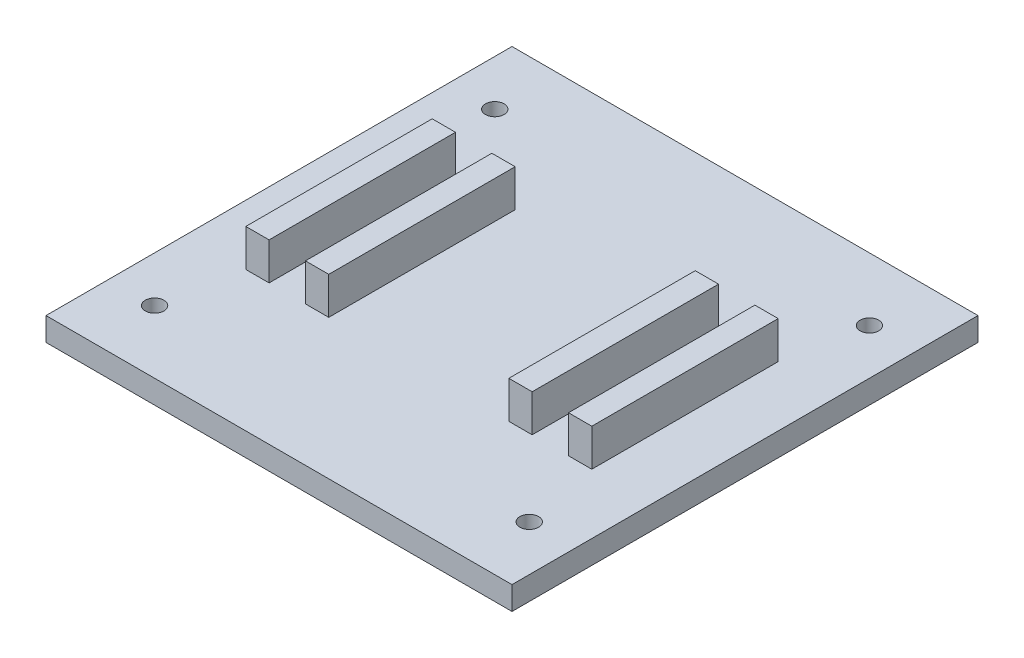
ISO-10303-21;
HEADER;
FILE_DESCRIPTION(('STEP AP214'),'2;1');
FILE_NAME('part.step','',(''),(''),'','','');
FILE_SCHEMA(('AUTOMOTIVE_DESIGN { 1 0 10303 214 1 1 1 1 }'));
ENDSEC;
DATA;
#1=APPLICATION_CONTEXT('core data for automotive mechanical design processes');
#2=APPLICATION_PROTOCOL_DEFINITION('international standard','automotive_design',2000,#1);
#3=PRODUCT_CONTEXT('',#1,'mechanical');
#4=PRODUCT('Part','Part','',(#3));
#5=PRODUCT_RELATED_PRODUCT_CATEGORY('part','',(#4));
#6=PRODUCT_DEFINITION_FORMATION('','',#4);
#7=PRODUCT_DEFINITION_CONTEXT('part definition',#1,'design');
#8=PRODUCT_DEFINITION('design','',#6,#7);
#9=PRODUCT_DEFINITION_SHAPE('','',#8);
#10=(LENGTH_UNIT() NAMED_UNIT(*) SI_UNIT(.MILLI.,.METRE.));
#11=(NAMED_UNIT(*) PLANE_ANGLE_UNIT() SI_UNIT($,.RADIAN.));
#12=(NAMED_UNIT(*) SI_UNIT($,.STERADIAN.) SOLID_ANGLE_UNIT());
#13=UNCERTAINTY_MEASURE_WITH_UNIT(LENGTH_MEASURE(1.E-05),#10,'distance_accuracy_value','');
#14=(GEOMETRIC_REPRESENTATION_CONTEXT(3) GLOBAL_UNCERTAINTY_ASSIGNED_CONTEXT((#13)) GLOBAL_UNIT_ASSIGNED_CONTEXT((#10,
#11,#12)) REPRESENTATION_CONTEXT('',''));
#15=CARTESIAN_POINT('',(0.,0.,0.));
#16=DIRECTION('',(0.,0.,1.));
#17=DIRECTION('',(1.,0.,0.));
#18=AXIS2_PLACEMENT_3D('',#15,#16,#17);
#19=CARTESIAN_POINT('',(0.,5.,0.));
#20=DIRECTION('',(0.,1.,0.));
#21=DIRECTION('',(0.,0.,1.));
#22=AXIS2_PLACEMENT_3D('',#19,#20,#21);
#23=PLANE('',#22);
#24=CARTESIAN_POINT('',(-40.2,5.,-36.5));
#25=DIRECTION('',(0.,1.,0.));
#26=DIRECTION('',(0.,0.,-1.));
#27=AXIS2_PLACEMENT_3D('',#24,#25,#26);
#28=CIRCLE('',#27,2.);
#29=CARTESIAN_POINT('',(-40.2,5.,-38.5));
#30=VERTEX_POINT('',#29);
#31=EDGE_CURVE('E714',#30,#30,#28,.T.);
#32=ORIENTED_EDGE('',*,*,#31,.F.);
#33=EDGE_LOOP('',(#32));
#34=FACE_BOUND('',#33,.T.);
#35=CARTESIAN_POINT('',(-40.2,5.,36.5));
#36=DIRECTION('',(0.,1.,0.));
#37=DIRECTION('',(0.,0.,1.));
#38=AXIS2_PLACEMENT_3D('',#35,#36,#37);
#39=CIRCLE('',#38,2.);
#40=CARTESIAN_POINT('',(-40.2,5.,38.5));
#41=VERTEX_POINT('',#40);
#42=EDGE_CURVE('E716',#41,#41,#39,.T.);
#43=ORIENTED_EDGE('',*,*,#42,.F.);
#44=EDGE_LOOP('',(#43));
#45=FACE_BOUND('',#44,.T.);
#46=CARTESIAN_POINT('',(40.2,5.,36.5));
#47=DIRECTION('',(0.,1.,0.));
#48=DIRECTION('',(0.,0.,-1.));
#49=AXIS2_PLACEMENT_3D('',#46,#47,#48);
#50=CIRCLE('',#49,2.);
#51=CARTESIAN_POINT('',(40.2,5.,34.5));
#52=VERTEX_POINT('',#51);
#53=EDGE_CURVE('E720',#52,#52,#50,.T.);
#54=ORIENTED_EDGE('',*,*,#53,.F.);
#55=EDGE_LOOP('',(#54));
#56=FACE_BOUND('',#55,.T.);
#57=CARTESIAN_POINT('',(40.2,5.,-36.5));
#58=DIRECTION('',(0.,1.,0.));
#59=DIRECTION('',(0.,0.,1.));
#60=AXIS2_PLACEMENT_3D('',#57,#58,#59);
#61=CIRCLE('',#60,2.);
#62=CARTESIAN_POINT('',(40.2,5.,-34.5));
#63=VERTEX_POINT('',#62);
#64=EDGE_CURVE('E393',#63,#63,#61,.T.);
#65=ORIENTED_EDGE('',*,*,#64,.F.);
#66=EDGE_LOOP('',(#65));
#67=FACE_BOUND('',#66,.T.);
#68=DIRECTION('',(1.,0.,0.));
#69=VECTOR('',#68,1.);
#70=CARTESIAN_POINT('',(32.125,5.,-20.));
#71=LINE('',#70,#69);
#72=CARTESIAN_POINT('',(32.125,5.,-20.));
#73=VERTEX_POINT('',#72);
#74=CARTESIAN_POINT('',(37.125,5.,-20.));
#75=VERTEX_POINT('',#74);
#76=EDGE_CURVE('E176',#73,#75,#71,.T.);
#77=ORIENTED_EDGE('',*,*,#76,.T.);
#78=DIRECTION('',(0.,0.,1.));
#79=VECTOR('',#78,1.);
#80=CARTESIAN_POINT('',(37.125,5.,-20.));
#81=LINE('',#80,#79);
#82=CARTESIAN_POINT('',(37.125,5.,20.));
#83=VERTEX_POINT('',#82);
#84=EDGE_CURVE('E180',#75,#83,#81,.T.);
#85=ORIENTED_EDGE('',*,*,#84,.T.);
#86=DIRECTION('',(-1.,0.,0.));
#87=VECTOR('',#86,1.);
#88=CARTESIAN_POINT('',(37.125,5.,20.));
#89=LINE('',#88,#87);
#90=CARTESIAN_POINT('',(32.125,5.,20.));
#91=VERTEX_POINT('',#90);
#92=EDGE_CURVE('E62',#83,#91,#89,.T.);
#93=ORIENTED_EDGE('',*,*,#92,.T.);
#94=DIRECTION('',(0.,0.,1.));
#95=VECTOR('',#94,1.);
#96=CARTESIAN_POINT('',(32.125,5.,-20.));
#97=LINE('',#96,#95);
#98=EDGE_CURVE('E57',#73,#91,#97,.T.);
#99=ORIENTED_EDGE('',*,*,#98,.F.);
#100=EDGE_LOOP('',(#77,#85,#93,#99));
#101=FACE_BOUND('',#100,.T.);
#102=DIRECTION('',(1.,0.,0.));
#103=VECTOR('',#102,1.);
#104=CARTESIAN_POINT('',(-24.325,5.,-20.));
#105=LINE('',#104,#103);
#106=CARTESIAN_POINT('',(-24.325,5.,-20.));
#107=VERTEX_POINT('',#106);
#108=CARTESIAN_POINT('',(-19.325,5.,-20.));
#109=VERTEX_POINT('',#108);
#110=EDGE_CURVE('E293',#107,#109,#105,.T.);
#111=ORIENTED_EDGE('',*,*,#110,.T.);
#112=DIRECTION('',(0.,0.,1.));
#113=VECTOR('',#112,1.);
#114=CARTESIAN_POINT('',(-19.325,5.,-20.));
#115=LINE('',#114,#113);
#116=CARTESIAN_POINT('',(-19.325,5.,20.));
#117=VERTEX_POINT('',#116);
#118=EDGE_CURVE('E324',#109,#117,#115,.T.);
#119=ORIENTED_EDGE('',*,*,#118,.T.);
#120=DIRECTION('',(1.,0.,0.));
#121=VECTOR('',#120,1.);
#122=CARTESIAN_POINT('',(-24.325,5.,20.));
#123=LINE('',#122,#121);
#124=CARTESIAN_POINT('',(-24.325,5.,20.));
#125=VERTEX_POINT('',#124);
#126=EDGE_CURVE('E327',#125,#117,#123,.T.);
#127=ORIENTED_EDGE('',*,*,#126,.F.);
#128=DIRECTION('',(0.,0.,1.));
#129=VECTOR('',#128,1.);
#130=CARTESIAN_POINT('',(-24.325,5.,-20.));
#131=LINE('',#130,#129);
#132=EDGE_CURVE('E311',#107,#125,#131,.T.);
#133=ORIENTED_EDGE('',*,*,#132,.F.);
#134=EDGE_LOOP('',(#111,#119,#127,#133));
#135=FACE_BOUND('',#134,.T.);
#136=DIRECTION('',(1.,0.,0.));
#137=VECTOR('',#136,1.);
#138=CARTESIAN_POINT('',(-50.,5.,50.));
#139=LINE('',#138,#137);
#140=CARTESIAN_POINT('',(-50.,5.,50.));
#141=VERTEX_POINT('',#140);
#142=CARTESIAN_POINT('',(50.,5.,50.));
#143=VERTEX_POINT('',#142);
#144=EDGE_CURVE('E350',#141,#143,#139,.T.);
#145=ORIENTED_EDGE('',*,*,#144,.T.);
#146=DIRECTION('',(0.,0.,-1.));
#147=VECTOR('',#146,1.);
#148=CARTESIAN_POINT('',(50.,5.,50.));
#149=LINE('',#148,#147);
#150=CARTESIAN_POINT('',(50.,5.,-50.));
#151=VERTEX_POINT('',#150);
#152=EDGE_CURVE('E354',#143,#151,#149,.T.);
#153=ORIENTED_EDGE('',*,*,#152,.T.);
#154=DIRECTION('',(1.,0.,0.));
#155=VECTOR('',#154,1.);
#156=CARTESIAN_POINT('',(-50.,5.,-50.));
#157=LINE('',#156,#155);
#158=CARTESIAN_POINT('',(-50.,5.,-50.));
#159=VERTEX_POINT('',#158);
#160=EDGE_CURVE('E358',#159,#151,#157,.T.);
#161=ORIENTED_EDGE('',*,*,#160,.F.);
#162=DIRECTION('',(0.,0.,-1.));
#163=VECTOR('',#162,1.);
#164=CARTESIAN_POINT('',(-50.,5.,50.));
#165=LINE('',#164,#163);
#166=EDGE_CURVE('E362',#141,#159,#165,.T.);
#167=ORIENTED_EDGE('',*,*,#166,.F.);
#168=EDGE_LOOP('',(#145,#153,#161,#167));
#169=FACE_BOUND('',#168,.T.);
#170=DIRECTION('',(0.,0.,1.));
#171=VECTOR('',#170,1.);
#172=CARTESIAN_POINT('',(-37.125,5.,-20.));
#173=LINE('',#172,#171);
#174=CARTESIAN_POINT('',(-37.125,5.,-20.));
#175=VERTEX_POINT('',#174);
#176=CARTESIAN_POINT('',(-37.125,5.,20.));
#177=VERTEX_POINT('',#176);
#178=EDGE_CURVE('E285',#175,#177,#173,.T.);
#179=ORIENTED_EDGE('',*,*,#178,.F.);
#180=DIRECTION('',(-1.,0.,0.));
#181=VECTOR('',#180,1.);
#182=CARTESIAN_POINT('',(-32.125,5.,-20.));
#183=LINE('',#182,#181);
#184=CARTESIAN_POINT('',(-32.125,5.,-20.));
#185=VERTEX_POINT('',#184);
#186=EDGE_CURVE('E289',#185,#175,#183,.T.);
#187=ORIENTED_EDGE('',*,*,#186,.F.);
#188=DIRECTION('',(0.,0.,1.));
#189=VECTOR('',#188,1.);
#190=CARTESIAN_POINT('',(-32.125,5.,-20.));
#191=LINE('',#190,#189);
#192=CARTESIAN_POINT('',(-32.125,5.,20.));
#193=VERTEX_POINT('',#192);
#194=EDGE_CURVE('E277',#185,#193,#191,.T.);
#195=ORIENTED_EDGE('',*,*,#194,.T.);
#196=DIRECTION('',(1.,0.,0.));
#197=VECTOR('',#196,1.);
#198=CARTESIAN_POINT('',(-37.125,5.,20.));
#199=LINE('',#198,#197);
#200=EDGE_CURVE('E280',#177,#193,#199,.T.);
#201=ORIENTED_EDGE('',*,*,#200,.F.);
#202=EDGE_LOOP('',(#179,#187,#195,#201));
#203=FACE_BOUND('',#202,.T.);
#204=DIRECTION('',(0.,0.,1.));
#205=VECTOR('',#204,1.);
#206=CARTESIAN_POINT('',(19.325,5.,-20.));
#207=LINE('',#206,#205);
#208=CARTESIAN_POINT('',(19.325,5.,-20.));
#209=VERTEX_POINT('',#208);
#210=CARTESIAN_POINT('',(19.325,5.,20.));
#211=VERTEX_POINT('',#210);
#212=EDGE_CURVE('E239',#209,#211,#207,.T.);
#213=ORIENTED_EDGE('',*,*,#212,.F.);
#214=DIRECTION('',(-1.,0.,0.));
#215=VECTOR('',#214,1.);
#216=CARTESIAN_POINT('',(24.325,5.,-20.));
#217=LINE('',#216,#215);
#218=CARTESIAN_POINT('',(24.325,5.,-20.));
#219=VERTEX_POINT('',#218);
#220=EDGE_CURVE('E243',#219,#209,#217,.T.);
#221=ORIENTED_EDGE('',*,*,#220,.F.);
#222=DIRECTION('',(0.,0.,1.));
#223=VECTOR('',#222,1.);
#224=CARTESIAN_POINT('',(24.325,5.,-20.));
#225=LINE('',#224,#223);
#226=CARTESIAN_POINT('',(24.325,5.,20.));
#227=VERTEX_POINT('',#226);
#228=EDGE_CURVE('E232',#219,#227,#225,.T.);
#229=ORIENTED_EDGE('',*,*,#228,.T.);
#230=DIRECTION('',(-1.,0.,0.));
#231=VECTOR('',#230,1.);
#232=CARTESIAN_POINT('',(24.325,5.,20.));
#233=LINE('',#232,#231);
#234=EDGE_CURVE('E235',#227,#211,#233,.T.);
#235=ORIENTED_EDGE('',*,*,#234,.T.);
#236=EDGE_LOOP('',(#213,#221,#229,#235));
#237=FACE_BOUND('',#236,.T.);
#238=ADVANCED_FACE('F39',(#34,#45,#56,#67,#101,#135,#169,#203,#237),#23,.T.);
#239=CARTESIAN_POINT('',(-50.,5.,50.));
#240=DIRECTION('',(0.,0.,-1.));
#241=DIRECTION('',(-1.,0.,0.));
#242=AXIS2_PLACEMENT_3D('',#239,#240,#241);
#243=PLANE('',#242);
#244=DIRECTION('',(1.,0.,0.));
#245=VECTOR('',#244,1.);
#246=CARTESIAN_POINT('',(-50.,0.,50.));
#247=LINE('',#246,#245);
#248=CARTESIAN_POINT('',(-50.,0.,50.));
#249=VERTEX_POINT('',#248);
#250=CARTESIAN_POINT('',(50.,0.,50.));
#251=VERTEX_POINT('',#250);
#252=EDGE_CURVE('E338',#249,#251,#247,.T.);
#253=ORIENTED_EDGE('',*,*,#252,.T.);
#254=DIRECTION('',(0.,-1.,0.));
#255=VECTOR('',#254,1.);
#256=CARTESIAN_POINT('',(50.,5.,50.));
#257=LINE('',#256,#255);
#258=EDGE_CURVE('E11',#143,#251,#257,.T.);
#259=ORIENTED_EDGE('',*,*,#258,.F.);
#260=ORIENTED_EDGE('',*,*,#144,.F.);
#261=DIRECTION('',(0.,-1.,0.));
#262=VECTOR('',#261,1.);
#263=CARTESIAN_POINT('',(-50.,5.,50.));
#264=LINE('',#263,#262);
#265=EDGE_CURVE('E366',#141,#249,#264,.T.);
#266=ORIENTED_EDGE('',*,*,#265,.T.);
#267=EDGE_LOOP('',(#253,#259,#260,#266));
#268=FACE_BOUND('',#267,.T.);
#269=ADVANCED_FACE('F41',(#268),#243,.F.);
#270=CARTESIAN_POINT('',(50.,5.,50.));
#271=DIRECTION('',(-1.,0.,0.));
#272=DIRECTION('',(0.,0.,1.));
#273=AXIS2_PLACEMENT_3D('',#270,#271,#272);
#274=PLANE('',#273);
#275=DIRECTION('',(0.,0.,-1.));
#276=VECTOR('',#275,1.);
#277=CARTESIAN_POINT('',(50.,0.,50.));
#278=LINE('',#277,#276);
#279=CARTESIAN_POINT('',(50.,0.,-50.));
#280=VERTEX_POINT('',#279);
#281=EDGE_CURVE('E370',#251,#280,#278,.T.);
#282=ORIENTED_EDGE('',*,*,#281,.T.);
#283=DIRECTION('',(0.,-1.,0.));
#284=VECTOR('',#283,1.);
#285=CARTESIAN_POINT('',(50.,5.,-50.));
#286=LINE('',#285,#284);
#287=EDGE_CURVE('E49',#151,#280,#286,.T.);
#288=ORIENTED_EDGE('',*,*,#287,.F.);
#289=ORIENTED_EDGE('',*,*,#152,.F.);
#290=ORIENTED_EDGE('',*,*,#258,.T.);
#291=EDGE_LOOP('',(#282,#288,#289,#290));
#292=FACE_BOUND('',#291,.T.);
#293=ADVANCED_FACE('F441',(#292),#274,.F.);
#294=CARTESIAN_POINT('',(-50.,5.,-50.));
#295=DIRECTION('',(0.,0.,-1.));
#296=DIRECTION('',(-1.,0.,0.));
#297=AXIS2_PLACEMENT_3D('',#294,#295,#296);
#298=PLANE('',#297);
#299=DIRECTION('',(1.,0.,0.));
#300=VECTOR('',#299,1.);
#301=CARTESIAN_POINT('',(-50.,0.,-50.));
#302=LINE('',#301,#300);
#303=CARTESIAN_POINT('',(-50.,0.,-50.));
#304=VERTEX_POINT('',#303);
#305=EDGE_CURVE('E374',#304,#280,#302,.T.);
#306=ORIENTED_EDGE('',*,*,#305,.F.);
#307=DIRECTION('',(0.,-1.,0.));
#308=VECTOR('',#307,1.);
#309=CARTESIAN_POINT('',(-50.,5.,-50.));
#310=LINE('',#309,#308);
#311=EDGE_CURVE('E383',#159,#304,#310,.T.);
#312=ORIENTED_EDGE('',*,*,#311,.F.);
#313=ORIENTED_EDGE('',*,*,#160,.T.);
#314=ORIENTED_EDGE('',*,*,#287,.T.);
#315=EDGE_LOOP('',(#306,#312,#313,#314));
#316=FACE_BOUND('',#315,.T.);
#317=ADVANCED_FACE('F455',(#316),#298,.T.);
#318=CARTESIAN_POINT('',(-50.,5.,50.));
#319=DIRECTION('',(-1.,0.,0.));
#320=DIRECTION('',(0.,0.,1.));
#321=AXIS2_PLACEMENT_3D('',#318,#319,#320);
#322=PLANE('',#321);
#323=DIRECTION('',(0.,0.,-1.));
#324=VECTOR('',#323,1.);
#325=CARTESIAN_POINT('',(-50.,0.,50.));
#326=LINE('',#325,#324);
#327=EDGE_CURVE('E355',#249,#304,#326,.T.);
#328=ORIENTED_EDGE('',*,*,#327,.F.);
#329=ORIENTED_EDGE('',*,*,#265,.F.);
#330=ORIENTED_EDGE('',*,*,#166,.T.);
#331=ORIENTED_EDGE('',*,*,#311,.T.);
#332=EDGE_LOOP('',(#328,#329,#330,#331));
#333=FACE_BOUND('',#332,.T.);
#334=ADVANCED_FACE('F452',(#333),#322,.T.);
#335=CARTESIAN_POINT('',(0.,0.,0.));
#336=DIRECTION('',(0.,1.,0.));
#337=DIRECTION('',(0.,0.,1.));
#338=AXIS2_PLACEMENT_3D('',#335,#336,#337);
#339=PLANE('',#338);
#340=CARTESIAN_POINT('',(-40.2,0.,-36.5));
#341=DIRECTION('',(0.,1.,0.));
#342=DIRECTION('',(0.,0.,1.));
#343=AXIS2_PLACEMENT_3D('',#340,#341,#342);
#344=CIRCLE('',#343,2.);
#345=CARTESIAN_POINT('',(-40.2,0.,-34.5));
#346=VERTEX_POINT('',#345);
#347=EDGE_CURVE('E43',#346,#346,#344,.T.);
#348=ORIENTED_EDGE('',*,*,#347,.T.);
#349=EDGE_LOOP('',(#348));
#350=FACE_BOUND('',#349,.T.);
#351=CARTESIAN_POINT('',(-40.2,0.,36.5));
#352=DIRECTION('',(0.,1.,0.));
#353=DIRECTION('',(0.,0.,1.));
#354=AXIS2_PLACEMENT_3D('',#351,#352,#353);
#355=CIRCLE('',#354,2.);
#356=CARTESIAN_POINT('',(-40.2,0.,38.5));
#357=VERTEX_POINT('',#356);
#358=EDGE_CURVE('E396',#357,#357,#355,.T.);
#359=ORIENTED_EDGE('',*,*,#358,.T.);
#360=EDGE_LOOP('',(#359));
#361=FACE_BOUND('',#360,.T.);
#362=CARTESIAN_POINT('',(40.2,0.,36.5));
#363=DIRECTION('',(0.,1.,0.));
#364=DIRECTION('',(0.,0.,1.));
#365=AXIS2_PLACEMENT_3D('',#362,#363,#364);
#366=CIRCLE('',#365,2.);
#367=CARTESIAN_POINT('',(40.2,0.,38.5));
#368=VERTEX_POINT('',#367);
#369=EDGE_CURVE('E392',#368,#368,#366,.T.);
#370=ORIENTED_EDGE('',*,*,#369,.T.);
#371=EDGE_LOOP('',(#370));
#372=FACE_BOUND('',#371,.T.);
#373=CARTESIAN_POINT('',(40.2,0.,-36.5));
#374=DIRECTION('',(0.,1.,0.));
#375=DIRECTION('',(0.,0.,1.));
#376=AXIS2_PLACEMENT_3D('',#373,#374,#375);
#377=CIRCLE('',#376,2.);
#378=CARTESIAN_POINT('',(40.2,0.,-34.5));
#379=VERTEX_POINT('',#378);
#380=EDGE_CURVE('E388',#379,#379,#377,.T.);
#381=ORIENTED_EDGE('',*,*,#380,.T.);
#382=EDGE_LOOP('',(#381));
#383=FACE_BOUND('',#382,.T.);
#384=ORIENTED_EDGE('',*,*,#252,.F.);
#385=ORIENTED_EDGE('',*,*,#327,.T.);
#386=ORIENTED_EDGE('',*,*,#305,.T.);
#387=ORIENTED_EDGE('',*,*,#281,.F.);
#388=EDGE_LOOP('',(#384,#385,#386,#387));
#389=FACE_BOUND('',#388,.T.);
#390=ADVANCED_FACE('F449',(#350,#361,#372,#383,#389),#339,.F.);
#391=CARTESIAN_POINT('',(-24.325,13.,-20.));
#392=DIRECTION('',(0.,0.,-1.));
#393=DIRECTION('',(-1.,0.,0.));
#394=AXIS2_PLACEMENT_3D('',#391,#392,#393);
#395=PLANE('',#394);
#396=ORIENTED_EDGE('',*,*,#110,.F.);
#397=DIRECTION('',(0.,-1.,0.));
#398=VECTOR('',#397,1.);
#399=CARTESIAN_POINT('',(-24.325,13.,-20.));
#400=LINE('',#399,#398);
#401=CARTESIAN_POINT('',(-24.325,13.,-20.));
#402=VERTEX_POINT('',#401);
#403=EDGE_CURVE('E334',#402,#107,#400,.T.);
#404=ORIENTED_EDGE('',*,*,#403,.F.);
#405=DIRECTION('',(1.,0.,0.));
#406=VECTOR('',#405,1.);
#407=CARTESIAN_POINT('',(-24.325,13.,-20.));
#408=LINE('',#407,#406);
#409=CARTESIAN_POINT('',(-19.325,13.,-20.));
#410=VERTEX_POINT('',#409);
#411=EDGE_CURVE('E306',#402,#410,#408,.T.);
#412=ORIENTED_EDGE('',*,*,#411,.T.);
#413=DIRECTION('',(0.,-1.,0.));
#414=VECTOR('',#413,1.);
#415=CARTESIAN_POINT('',(-19.325,13.,-20.));
#416=LINE('',#415,#414);
#417=EDGE_CURVE('E321',#410,#109,#416,.T.);
#418=ORIENTED_EDGE('',*,*,#417,.T.);
#419=EDGE_LOOP('',(#396,#404,#412,#418));
#420=FACE_BOUND('',#419,.T.);
#421=ADVANCED_FACE('F447',(#420),#395,.T.);
#422=CARTESIAN_POINT('',(-24.325,13.,-20.));
#423=DIRECTION('',(1.,0.,0.));
#424=DIRECTION('',(0.,0.,-1.));
#425=AXIS2_PLACEMENT_3D('',#422,#423,#424);
#426=PLANE('',#425);
#427=ORIENTED_EDGE('',*,*,#132,.T.);
#428=DIRECTION('',(0.,-1.,0.));
#429=VECTOR('',#428,1.);
#430=CARTESIAN_POINT('',(-24.325,13.,20.));
#431=LINE('',#430,#429);
#432=CARTESIAN_POINT('',(-24.325,13.,20.));
#433=VERTEX_POINT('',#432);
#434=EDGE_CURVE('E339',#433,#125,#431,.T.);
#435=ORIENTED_EDGE('',*,*,#434,.F.);
#436=DIRECTION('',(0.,0.,1.));
#437=VECTOR('',#436,1.);
#438=CARTESIAN_POINT('',(-24.325,13.,-20.));
#439=LINE('',#438,#437);
#440=EDGE_CURVE('E318',#402,#433,#439,.T.);
#441=ORIENTED_EDGE('',*,*,#440,.F.);
#442=ORIENTED_EDGE('',*,*,#403,.T.);
#443=EDGE_LOOP('',(#427,#435,#441,#442));
#444=FACE_BOUND('',#443,.T.);
#445=ADVANCED_FACE('F527',(#444),#426,.F.);
#446=CARTESIAN_POINT('',(-24.325,13.,20.));
#447=DIRECTION('',(0.,0.,-1.));
#448=DIRECTION('',(-1.,0.,0.));
#449=AXIS2_PLACEMENT_3D('',#446,#447,#448);
#450=PLANE('',#449);
#451=ORIENTED_EDGE('',*,*,#126,.T.);
#452=DIRECTION('',(0.,-1.,0.));
#453=VECTOR('',#452,1.);
#454=CARTESIAN_POINT('',(-19.325,13.,20.));
#455=LINE('',#454,#453);
#456=CARTESIAN_POINT('',(-19.325,13.,20.));
#457=VERTEX_POINT('',#456);
#458=EDGE_CURVE('E343',#457,#117,#455,.T.);
#459=ORIENTED_EDGE('',*,*,#458,.F.);
#460=DIRECTION('',(1.,0.,0.));
#461=VECTOR('',#460,1.);
#462=CARTESIAN_POINT('',(-24.325,13.,20.));
#463=LINE('',#462,#461);
#464=EDGE_CURVE('E315',#433,#457,#463,.T.);
#465=ORIENTED_EDGE('',*,*,#464,.F.);
#466=ORIENTED_EDGE('',*,*,#434,.T.);
#467=EDGE_LOOP('',(#451,#459,#465,#466));
#468=FACE_BOUND('',#467,.T.);
#469=ADVANCED_FACE('F530',(#468),#450,.F.);
#470=CARTESIAN_POINT('',(-19.325,13.,-20.));
#471=DIRECTION('',(1.,0.,0.));
#472=DIRECTION('',(0.,0.,-1.));
#473=AXIS2_PLACEMENT_3D('',#470,#471,#472);
#474=PLANE('',#473);
#475=ORIENTED_EDGE('',*,*,#118,.F.);
#476=ORIENTED_EDGE('',*,*,#417,.F.);
#477=DIRECTION('',(0.,0.,1.));
#478=VECTOR('',#477,1.);
#479=CARTESIAN_POINT('',(-19.325,13.,-20.));
#480=LINE('',#479,#478);
#481=EDGE_CURVE('E310',#410,#457,#480,.T.);
#482=ORIENTED_EDGE('',*,*,#481,.T.);
#483=ORIENTED_EDGE('',*,*,#458,.T.);
#484=EDGE_LOOP('',(#475,#476,#482,#483));
#485=FACE_BOUND('',#484,.T.);
#486=ADVANCED_FACE('F525',(#485),#474,.T.);
#487=CARTESIAN_POINT('',(0.,13.,0.));
#488=DIRECTION('',(0.,-1.,0.));
#489=DIRECTION('',(0.,0.,-1.));
#490=AXIS2_PLACEMENT_3D('',#487,#488,#489);
#491=PLANE('',#490);
#492=ORIENTED_EDGE('',*,*,#411,.F.);
#493=ORIENTED_EDGE('',*,*,#440,.T.);
#494=ORIENTED_EDGE('',*,*,#464,.T.);
#495=ORIENTED_EDGE('',*,*,#481,.F.);
#496=EDGE_LOOP('',(#492,#493,#494,#495));
#497=FACE_BOUND('',#496,.T.);
#498=ADVANCED_FACE('F506',(#497),#491,.F.);
#499=CARTESIAN_POINT('',(-32.125,13.,-20.));
#500=DIRECTION('',(0.,0.,1.));
#501=DIRECTION('',(1.,0.,0.));
#502=AXIS2_PLACEMENT_3D('',#499,#500,#501);
#503=PLANE('',#502);
#504=ORIENTED_EDGE('',*,*,#186,.T.);
#505=DIRECTION('',(0.,-1.,0.));
#506=VECTOR('',#505,1.);
#507=CARTESIAN_POINT('',(-37.125,13.,-20.));
#508=LINE('',#507,#506);
#509=CARTESIAN_POINT('',(-37.125,13.,-20.));
#510=VERTEX_POINT('',#509);
#511=EDGE_CURVE('E247',#510,#175,#508,.T.);
#512=ORIENTED_EDGE('',*,*,#511,.F.);
#513=DIRECTION('',(-1.,0.,0.));
#514=VECTOR('',#513,1.);
#515=CARTESIAN_POINT('',(-32.125,13.,-20.));
#516=LINE('',#515,#514);
#517=CARTESIAN_POINT('',(-32.125,13.,-20.));
#518=VERTEX_POINT('',#517);
#519=EDGE_CURVE('E281',#518,#510,#516,.T.);
#520=ORIENTED_EDGE('',*,*,#519,.F.);
#521=DIRECTION('',(0.,-1.,0.));
#522=VECTOR('',#521,1.);
#523=CARTESIAN_POINT('',(-32.125,13.,-20.));
#524=LINE('',#523,#522);
#525=EDGE_CURVE('E272',#518,#185,#524,.T.);
#526=ORIENTED_EDGE('',*,*,#525,.T.);
#527=EDGE_LOOP('',(#504,#512,#520,#526));
#528=FACE_BOUND('',#527,.T.);
#529=ADVANCED_FACE('F502',(#528),#503,.F.);
#530=CARTESIAN_POINT('',(-37.125,13.,-20.));
#531=DIRECTION('',(1.,0.,0.));
#532=DIRECTION('',(0.,0.,-1.));
#533=AXIS2_PLACEMENT_3D('',#530,#531,#532);
#534=PLANE('',#533);
#535=ORIENTED_EDGE('',*,*,#178,.T.);
#536=DIRECTION('',(0.,-1.,0.));
#537=VECTOR('',#536,1.);
#538=CARTESIAN_POINT('',(-37.125,13.,20.));
#539=LINE('',#538,#537);
#540=CARTESIAN_POINT('',(-37.125,13.,20.));
#541=VERTEX_POINT('',#540);
#542=EDGE_CURVE('E264',#541,#177,#539,.T.);
#543=ORIENTED_EDGE('',*,*,#542,.F.);
#544=DIRECTION('',(0.,0.,1.));
#545=VECTOR('',#544,1.);
#546=CARTESIAN_POINT('',(-37.125,13.,-20.));
#547=LINE('',#546,#545);
#548=EDGE_CURVE('E300',#510,#541,#547,.T.);
#549=ORIENTED_EDGE('',*,*,#548,.F.);
#550=ORIENTED_EDGE('',*,*,#511,.T.);
#551=EDGE_LOOP('',(#535,#543,#549,#550));
#552=FACE_BOUND('',#551,.T.);
#553=ADVANCED_FACE('F505',(#552),#534,.F.);
#554=CARTESIAN_POINT('',(-37.125,13.,20.));
#555=DIRECTION('',(0.,0.,-1.));
#556=DIRECTION('',(-1.,0.,0.));
#557=AXIS2_PLACEMENT_3D('',#554,#555,#556);
#558=PLANE('',#557);
#559=ORIENTED_EDGE('',*,*,#200,.T.);
#560=DIRECTION('',(0.,-1.,0.));
#561=VECTOR('',#560,1.);
#562=CARTESIAN_POINT('',(-32.125,13.,20.));
#563=LINE('',#562,#561);
#564=CARTESIAN_POINT('',(-32.125,13.,20.));
#565=VERTEX_POINT('',#564);
#566=EDGE_CURVE('E268',#565,#193,#563,.T.);
#567=ORIENTED_EDGE('',*,*,#566,.F.);
#568=DIRECTION('',(1.,0.,0.));
#569=VECTOR('',#568,1.);
#570=CARTESIAN_POINT('',(-37.125,13.,20.));
#571=LINE('',#570,#569);
#572=EDGE_CURVE('E297',#541,#565,#571,.T.);
#573=ORIENTED_EDGE('',*,*,#572,.F.);
#574=ORIENTED_EDGE('',*,*,#542,.T.);
#575=EDGE_LOOP('',(#559,#567,#573,#574));
#576=FACE_BOUND('',#575,.T.);
#577=ADVANCED_FACE('F510',(#576),#558,.F.);
#578=CARTESIAN_POINT('',(-32.125,13.,-20.));
#579=DIRECTION('',(1.,0.,0.));
#580=DIRECTION('',(0.,0.,-1.));
#581=AXIS2_PLACEMENT_3D('',#578,#579,#580);
#582=PLANE('',#581);
#583=ORIENTED_EDGE('',*,*,#194,.F.);
#584=ORIENTED_EDGE('',*,*,#525,.F.);
#585=DIRECTION('',(0.,0.,1.));
#586=VECTOR('',#585,1.);
#587=CARTESIAN_POINT('',(-32.125,13.,-20.));
#588=LINE('',#587,#586);
#589=EDGE_CURVE('E276',#518,#565,#588,.T.);
#590=ORIENTED_EDGE('',*,*,#589,.T.);
#591=ORIENTED_EDGE('',*,*,#566,.T.);
#592=EDGE_LOOP('',(#583,#584,#590,#591));
#593=FACE_BOUND('',#592,.T.);
#594=ADVANCED_FACE('F514',(#593),#582,.T.);
#595=CARTESIAN_POINT('',(0.,13.,0.));
#596=DIRECTION('',(0.,1.,0.));
#597=DIRECTION('',(0.,0.,1.));
#598=AXIS2_PLACEMENT_3D('',#595,#596,#597);
#599=PLANE('',#598);
#600=ORIENTED_EDGE('',*,*,#519,.T.);
#601=ORIENTED_EDGE('',*,*,#548,.T.);
#602=ORIENTED_EDGE('',*,*,#572,.T.);
#603=ORIENTED_EDGE('',*,*,#589,.F.);
#604=EDGE_LOOP('',(#600,#601,#602,#603));
#605=FACE_BOUND('',#604,.T.);
#606=ADVANCED_FACE('F518',(#605),#599,.T.);
#607=CARTESIAN_POINT('',(24.325,13.,-20.));
#608=DIRECTION('',(0.,0.,1.));
#609=DIRECTION('',(1.,0.,0.));
#610=AXIS2_PLACEMENT_3D('',#607,#608,#609);
#611=PLANE('',#610);
#612=ORIENTED_EDGE('',*,*,#220,.T.);
#613=DIRECTION('',(0.,-1.,0.));
#614=VECTOR('',#613,1.);
#615=CARTESIAN_POINT('',(19.325,13.,-20.));
#616=LINE('',#615,#614);
#617=CARTESIAN_POINT('',(19.325,13.,-20.));
#618=VERTEX_POINT('',#617);
#619=EDGE_CURVE('E184',#618,#209,#616,.T.);
#620=ORIENTED_EDGE('',*,*,#619,.F.);
#621=DIRECTION('',(-1.,0.,0.));
#622=VECTOR('',#621,1.);
#623=CARTESIAN_POINT('',(24.325,13.,-20.));
#624=LINE('',#623,#622);
#625=CARTESIAN_POINT('',(24.325,13.,-20.));
#626=VERTEX_POINT('',#625);
#627=EDGE_CURVE('E236',#626,#618,#624,.T.);
#628=ORIENTED_EDGE('',*,*,#627,.F.);
#629=DIRECTION('',(0.,-1.,0.));
#630=VECTOR('',#629,1.);
#631=CARTESIAN_POINT('',(24.325,13.,-20.));
#632=LINE('',#631,#630);
#633=EDGE_CURVE('E227',#626,#219,#632,.T.);
#634=ORIENTED_EDGE('',*,*,#633,.T.);
#635=EDGE_LOOP('',(#612,#620,#628,#634));
#636=FACE_BOUND('',#635,.T.);
#637=ADVANCED_FACE('F482',(#636),#611,.F.);
#638=CARTESIAN_POINT('',(19.325,13.,-20.));
#639=DIRECTION('',(1.,0.,0.));
#640=DIRECTION('',(0.,0.,-1.));
#641=AXIS2_PLACEMENT_3D('',#638,#639,#640);
#642=PLANE('',#641);
#643=ORIENTED_EDGE('',*,*,#212,.T.);
#644=DIRECTION('',(0.,-1.,0.));
#645=VECTOR('',#644,1.);
#646=CARTESIAN_POINT('',(19.325,13.,20.));
#647=LINE('',#646,#645);
#648=CARTESIAN_POINT('',(19.325,13.,20.));
#649=VERTEX_POINT('',#648);
#650=EDGE_CURVE('E219',#649,#211,#647,.T.);
#651=ORIENTED_EDGE('',*,*,#650,.F.);
#652=DIRECTION('',(0.,0.,1.));
#653=VECTOR('',#652,1.);
#654=CARTESIAN_POINT('',(19.325,13.,-20.));
#655=LINE('',#654,#653);
#656=EDGE_CURVE('E255',#618,#649,#655,.T.);
#657=ORIENTED_EDGE('',*,*,#656,.F.);
#658=ORIENTED_EDGE('',*,*,#619,.T.);
#659=EDGE_LOOP('',(#643,#651,#657,#658));
#660=FACE_BOUND('',#659,.T.);
#661=ADVANCED_FACE('F479',(#660),#642,.F.);
#662=CARTESIAN_POINT('',(24.325,13.,20.));
#663=DIRECTION('',(0.,0.,1.));
#664=DIRECTION('',(1.,0.,0.));
#665=AXIS2_PLACEMENT_3D('',#662,#663,#664);
#666=PLANE('',#665);
#667=ORIENTED_EDGE('',*,*,#234,.F.);
#668=DIRECTION('',(0.,-1.,0.));
#669=VECTOR('',#668,1.);
#670=CARTESIAN_POINT('',(24.325,13.,20.));
#671=LINE('',#670,#669);
#672=CARTESIAN_POINT('',(24.325,13.,20.));
#673=VERTEX_POINT('',#672);
#674=EDGE_CURVE('E223',#673,#227,#671,.T.);
#675=ORIENTED_EDGE('',*,*,#674,.F.);
#676=DIRECTION('',(-1.,0.,0.));
#677=VECTOR('',#676,1.);
#678=CARTESIAN_POINT('',(24.325,13.,20.));
#679=LINE('',#678,#677);
#680=EDGE_CURVE('E251',#673,#649,#679,.T.);
#681=ORIENTED_EDGE('',*,*,#680,.T.);
#682=ORIENTED_EDGE('',*,*,#650,.T.);
#683=EDGE_LOOP('',(#667,#675,#681,#682));
#684=FACE_BOUND('',#683,.T.);
#685=ADVANCED_FACE('F489',(#684),#666,.T.);
#686=CARTESIAN_POINT('',(24.325,13.,-20.));
#687=DIRECTION('',(1.,0.,0.));
#688=DIRECTION('',(0.,0.,-1.));
#689=AXIS2_PLACEMENT_3D('',#686,#687,#688);
#690=PLANE('',#689);
#691=ORIENTED_EDGE('',*,*,#228,.F.);
#692=ORIENTED_EDGE('',*,*,#633,.F.);
#693=DIRECTION('',(0.,0.,1.));
#694=VECTOR('',#693,1.);
#695=CARTESIAN_POINT('',(24.325,13.,-20.));
#696=LINE('',#695,#694);
#697=EDGE_CURVE('E231',#626,#673,#696,.T.);
#698=ORIENTED_EDGE('',*,*,#697,.T.);
#699=ORIENTED_EDGE('',*,*,#674,.T.);
#700=EDGE_LOOP('',(#691,#692,#698,#699));
#701=FACE_BOUND('',#700,.T.);
#702=ADVANCED_FACE('F486',(#701),#690,.T.);
#703=CARTESIAN_POINT('',(0.,13.,0.));
#704=DIRECTION('',(0.,1.,0.));
#705=DIRECTION('',(0.,0.,1.));
#706=AXIS2_PLACEMENT_3D('',#703,#704,#705);
#707=PLANE('',#706);
#708=ORIENTED_EDGE('',*,*,#627,.T.);
#709=ORIENTED_EDGE('',*,*,#656,.T.);
#710=ORIENTED_EDGE('',*,*,#680,.F.);
#711=ORIENTED_EDGE('',*,*,#697,.F.);
#712=EDGE_LOOP('',(#708,#709,#710,#711));
#713=FACE_BOUND('',#712,.T.);
#714=ADVANCED_FACE('F491',(#713),#707,.T.);
#715=CARTESIAN_POINT('',(32.125,13.,-20.));
#716=DIRECTION('',(0.,0.,-1.));
#717=DIRECTION('',(-1.,0.,0.));
#718=AXIS2_PLACEMENT_3D('',#715,#716,#717);
#719=PLANE('',#718);
#720=ORIENTED_EDGE('',*,*,#76,.F.);
#721=DIRECTION('',(0.,-1.,0.));
#722=VECTOR('',#721,1.);
#723=CARTESIAN_POINT('',(32.125,13.,-20.));
#724=LINE('',#723,#722);
#725=CARTESIAN_POINT('',(32.125,13.,-20.));
#726=VERTEX_POINT('',#725);
#727=EDGE_CURVE('E403',#726,#73,#724,.T.);
#728=ORIENTED_EDGE('',*,*,#727,.F.);
#729=DIRECTION('',(1.,0.,0.));
#730=VECTOR('',#729,1.);
#731=CARTESIAN_POINT('',(32.125,13.,-20.));
#732=LINE('',#731,#730);
#733=CARTESIAN_POINT('',(37.125,13.,-20.));
#734=VERTEX_POINT('',#733);
#735=EDGE_CURVE('E190',#726,#734,#732,.T.);
#736=ORIENTED_EDGE('',*,*,#735,.T.);
#737=DIRECTION('',(0.,-1.,0.));
#738=VECTOR('',#737,1.);
#739=CARTESIAN_POINT('',(37.125,13.,-20.));
#740=LINE('',#739,#738);
#741=EDGE_CURVE('E187',#734,#75,#740,.T.);
#742=ORIENTED_EDGE('',*,*,#741,.T.);
#743=EDGE_LOOP('',(#720,#728,#736,#742));
#744=FACE_BOUND('',#743,.T.);
#745=ADVANCED_FACE('F188',(#744),#719,.T.);
#746=CARTESIAN_POINT('',(32.125,13.,-20.));
#747=DIRECTION('',(1.,0.,0.));
#748=DIRECTION('',(0.,0.,-1.));
#749=AXIS2_PLACEMENT_3D('',#746,#747,#748);
#750=PLANE('',#749);
#751=ORIENTED_EDGE('',*,*,#98,.T.);
#752=DIRECTION('',(0.,-1.,0.));
#753=VECTOR('',#752,1.);
#754=CARTESIAN_POINT('',(32.125,13.,20.));
#755=LINE('',#754,#753);
#756=CARTESIAN_POINT('',(32.125,13.,20.));
#757=VERTEX_POINT('',#756);
#758=EDGE_CURVE('E407',#757,#91,#755,.T.);
#759=ORIENTED_EDGE('',*,*,#758,.F.);
#760=DIRECTION('',(0.,0.,1.));
#761=VECTOR('',#760,1.);
#762=CARTESIAN_POINT('',(32.125,13.,-20.));
#763=LINE('',#762,#761);
#764=EDGE_CURVE('E195',#726,#757,#763,.T.);
#765=ORIENTED_EDGE('',*,*,#764,.F.);
#766=ORIENTED_EDGE('',*,*,#727,.T.);
#767=EDGE_LOOP('',(#751,#759,#765,#766));
#768=FACE_BOUND('',#767,.T.);
#769=ADVANCED_FACE('F416',(#768),#750,.F.);
#770=CARTESIAN_POINT('',(37.125,13.,20.));
#771=DIRECTION('',(0.,0.,1.));
#772=DIRECTION('',(1.,0.,0.));
#773=AXIS2_PLACEMENT_3D('',#770,#771,#772);
#774=PLANE('',#773);
#775=ORIENTED_EDGE('',*,*,#92,.F.);
#776=DIRECTION('',(0.,-1.,0.));
#777=VECTOR('',#776,1.);
#778=CARTESIAN_POINT('',(37.125,13.,20.));
#779=LINE('',#778,#777);
#780=CARTESIAN_POINT('',(37.125,13.,20.));
#781=VERTEX_POINT('',#780);
#782=EDGE_CURVE('E196',#781,#83,#779,.T.);
#783=ORIENTED_EDGE('',*,*,#782,.F.);
#784=DIRECTION('',(-1.,0.,0.));
#785=VECTOR('',#784,1.);
#786=CARTESIAN_POINT('',(37.125,13.,20.));
#787=LINE('',#786,#785);
#788=EDGE_CURVE('E207',#781,#757,#787,.T.);
#789=ORIENTED_EDGE('',*,*,#788,.T.);
#790=ORIENTED_EDGE('',*,*,#758,.T.);
#791=EDGE_LOOP('',(#775,#783,#789,#790));
#792=FACE_BOUND('',#791,.T.);
#793=ADVANCED_FACE('F419',(#792),#774,.T.);
#794=CARTESIAN_POINT('',(37.125,13.,-20.));
#795=DIRECTION('',(1.,0.,0.));
#796=DIRECTION('',(0.,0.,-1.));
#797=AXIS2_PLACEMENT_3D('',#794,#795,#796);
#798=PLANE('',#797);
#799=ORIENTED_EDGE('',*,*,#84,.F.);
#800=ORIENTED_EDGE('',*,*,#741,.F.);
#801=DIRECTION('',(0.,0.,1.));
#802=VECTOR('',#801,1.);
#803=CARTESIAN_POINT('',(37.125,13.,-20.));
#804=LINE('',#803,#802);
#805=EDGE_CURVE('E211',#734,#781,#804,.T.);
#806=ORIENTED_EDGE('',*,*,#805,.T.);
#807=ORIENTED_EDGE('',*,*,#782,.T.);
#808=EDGE_LOOP('',(#799,#800,#806,#807));
#809=FACE_BOUND('',#808,.T.);
#810=ADVANCED_FACE('F198',(#809),#798,.T.);
#811=CARTESIAN_POINT('',(0.,13.,0.));
#812=DIRECTION('',(0.,-1.,0.));
#813=DIRECTION('',(0.,0.,-1.));
#814=AXIS2_PLACEMENT_3D('',#811,#812,#813);
#815=PLANE('',#814);
#816=ORIENTED_EDGE('',*,*,#735,.F.);
#817=ORIENTED_EDGE('',*,*,#764,.T.);
#818=ORIENTED_EDGE('',*,*,#788,.F.);
#819=ORIENTED_EDGE('',*,*,#805,.F.);
#820=EDGE_LOOP('',(#816,#817,#818,#819));
#821=FACE_BOUND('',#820,.T.);
#822=ADVANCED_FACE('F421',(#821),#815,.F.);
#823=CARTESIAN_POINT('',(40.2,-3.,-36.5));
#824=DIRECTION('',(0.,1.,0.));
#825=DIRECTION('',(0.,0.,1.));
#826=AXIS2_PLACEMENT_3D('',#823,#824,#825);
#827=CYLINDRICAL_SURFACE('',#826,2.);
#828=ORIENTED_EDGE('',*,*,#64,.T.);
#829=EDGE_LOOP('',(#828));
#830=FACE_BOUND('',#829,.T.);
#831=ORIENTED_EDGE('',*,*,#380,.F.);
#832=EDGE_LOOP('',(#831));
#833=FACE_BOUND('',#832,.T.);
#834=ADVANCED_FACE('F423',(#830,#833),#827,.F.);
#835=CARTESIAN_POINT('',(40.2,-3.,36.5));
#836=DIRECTION('',(0.,1.,0.));
#837=DIRECTION('',(0.,0.,1.));
#838=AXIS2_PLACEMENT_3D('',#835,#836,#837);
#839=CYLINDRICAL_SURFACE('',#838,2.);
#840=ORIENTED_EDGE('',*,*,#53,.T.);
#841=EDGE_LOOP('',(#840));
#842=FACE_BOUND('',#841,.T.);
#843=ORIENTED_EDGE('',*,*,#369,.F.);
#844=EDGE_LOOP('',(#843));
#845=FACE_BOUND('',#844,.T.);
#846=ADVANCED_FACE('F429',(#842,#845),#839,.F.);
#847=CARTESIAN_POINT('',(-40.2,-3.,36.5));
#848=DIRECTION('',(0.,1.,0.));
#849=DIRECTION('',(0.,0.,1.));
#850=AXIS2_PLACEMENT_3D('',#847,#848,#849);
#851=CYLINDRICAL_SURFACE('',#850,2.);
#852=ORIENTED_EDGE('',*,*,#42,.T.);
#853=EDGE_LOOP('',(#852));
#854=FACE_BOUND('',#853,.T.);
#855=ORIENTED_EDGE('',*,*,#358,.F.);
#856=EDGE_LOOP('',(#855));
#857=FACE_BOUND('',#856,.T.);
#858=ADVANCED_FACE('F688',(#854,#857),#851,.F.);
#859=CARTESIAN_POINT('',(-40.2,-3.,-36.5));
#860=DIRECTION('',(0.,1.,0.));
#861=DIRECTION('',(0.,0.,1.));
#862=AXIS2_PLACEMENT_3D('',#859,#860,#861);
#863=CYLINDRICAL_SURFACE('',#862,2.);
#864=ORIENTED_EDGE('',*,*,#31,.T.);
#865=EDGE_LOOP('',(#864));
#866=FACE_BOUND('',#865,.T.);
#867=ORIENTED_EDGE('',*,*,#347,.F.);
#868=EDGE_LOOP('',(#867));
#869=FACE_BOUND('',#868,.T.);
#870=ADVANCED_FACE('F698',(#866,#869),#863,.F.);
#871=CLOSED_SHELL('',(#238,#269,#293,#317,#334,#390,#421,#445,#469,#486,#498,#529,#553,#577,
#594,#606,#637,#661,#685,#702,#714,#745,#769,#793,#810,#822,#834,#846,#858,#870));
#872=MANIFOLD_SOLID_BREP('B2',#871);
#873=ADVANCED_BREP_SHAPE_REPRESENTATION('',(#18,#872),#14);
#874=SHAPE_DEFINITION_REPRESENTATION(#9,#873);
ENDSEC;
END-ISO-10303-21;
